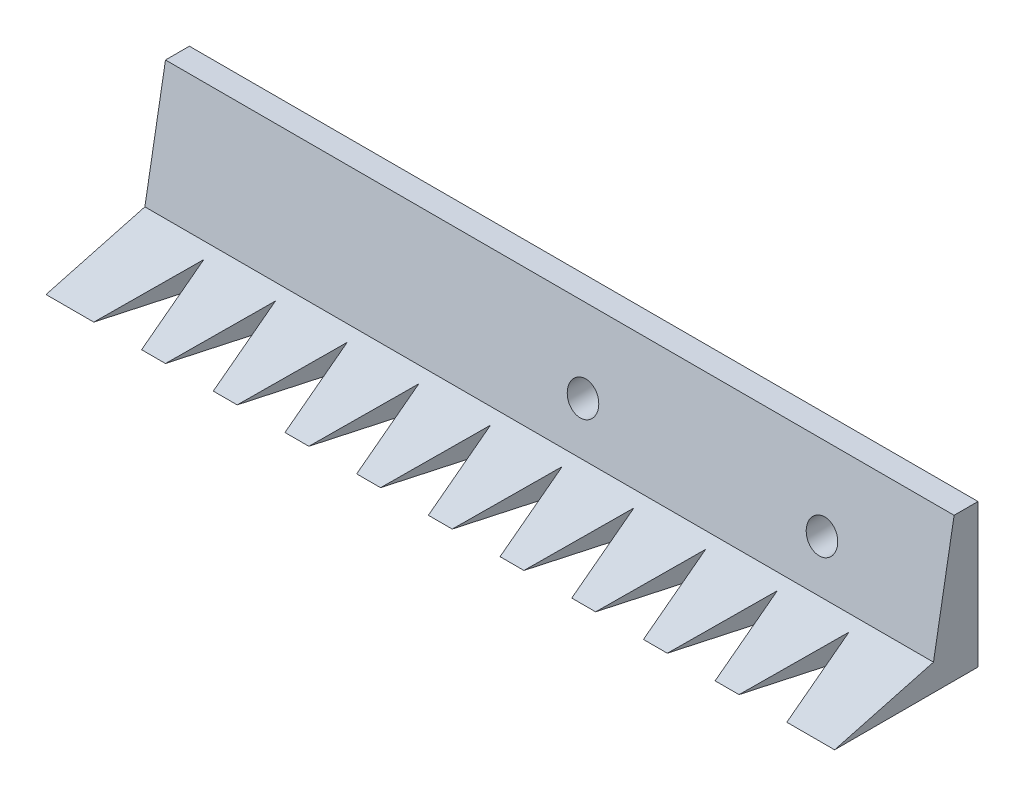
ISO-10303-21;
HEADER;
FILE_DESCRIPTION(('STEP AP214'),'2;1');
FILE_NAME('part.step','',(''),(''),'','','');
FILE_SCHEMA(('AUTOMOTIVE_DESIGN { 1 0 10303 214 1 1 1 1 }'));
ENDSEC;
DATA;
#1=APPLICATION_CONTEXT('core data for automotive mechanical design processes');
#2=APPLICATION_PROTOCOL_DEFINITION('international standard','automotive_design',2000,#1);
#3=PRODUCT_CONTEXT('',#1,'mechanical');
#4=PRODUCT('Part','Part','',(#3));
#5=PRODUCT_RELATED_PRODUCT_CATEGORY('part','',(#4));
#6=PRODUCT_DEFINITION_FORMATION('','',#4);
#7=PRODUCT_DEFINITION_CONTEXT('part definition',#1,'design');
#8=PRODUCT_DEFINITION('design','',#6,#7);
#9=PRODUCT_DEFINITION_SHAPE('','',#8);
#10=(LENGTH_UNIT() NAMED_UNIT(*) SI_UNIT(.MILLI.,.METRE.));
#11=(NAMED_UNIT(*) PLANE_ANGLE_UNIT() SI_UNIT($,.RADIAN.));
#12=(NAMED_UNIT(*) SI_UNIT($,.STERADIAN.) SOLID_ANGLE_UNIT());
#13=UNCERTAINTY_MEASURE_WITH_UNIT(LENGTH_MEASURE(1.E-05),#10,'distance_accuracy_value','');
#14=(GEOMETRIC_REPRESENTATION_CONTEXT(3) GLOBAL_UNCERTAINTY_ASSIGNED_CONTEXT((#13)) GLOBAL_UNIT_ASSIGNED_CONTEXT((#10,
#11,#12)) REPRESENTATION_CONTEXT('',''));
#15=CARTESIAN_POINT('',(0.,0.,0.));
#16=DIRECTION('',(0.,0.,1.));
#17=DIRECTION('',(1.,0.,0.));
#18=AXIS2_PLACEMENT_3D('',#15,#16,#17);
#19=CARTESIAN_POINT('',(100.,0.,30.));
#20=DIRECTION('',(0.,1.,0.));
#21=DIRECTION('',(0.,0.,1.));
#22=AXIS2_PLACEMENT_3D('',#19,#20,#21);
#23=PLANE('',#22);
#24=DIRECTION('',(0.267643863786095,0.,0.963517909629941));
#25=VECTOR('',#24,1.);
#26=CARTESIAN_POINT('',(-20.6876790830945,0.,63.5243553008596));
#27=LINE('',#26,#25);
#28=CARTESIAN_POINT('',(-35.,0.,12.));
#29=VERTEX_POINT('',#28);
#30=CARTESIAN_POINT('',(-30.,0.,30.));
#31=VERTEX_POINT('',#30);
#32=EDGE_CURVE('E267',#29,#31,#27,.T.);
#33=ORIENTED_EDGE('',*,*,#32,.F.);
#34=DIRECTION('',(0.267643863786095,0.,-0.963517909629941));
#35=VECTOR('',#34,1.);
#36=CARTESIAN_POINT('',(-29.9713467048711,0.,-6.10315186246417));
#37=LINE('',#36,#35);
#38=CARTESIAN_POINT('',(-40.,0.,30.));
#39=VERTEX_POINT('',#38);
#40=EDGE_CURVE('E265',#39,#29,#37,.T.);
#41=ORIENTED_EDGE('',*,*,#40,.F.);
#42=DIRECTION('',(-1.,0.,0.));
#43=VECTOR('',#42,1.);
#44=CARTESIAN_POINT('',(100.,0.,30.));
#45=LINE('',#44,#43);
#46=CARTESIAN_POINT('',(-45.,0.,30.));
#47=VERTEX_POINT('',#46);
#48=EDGE_CURVE('E321',#39,#47,#45,.T.);
#49=ORIENTED_EDGE('',*,*,#48,.T.);
#50=DIRECTION('',(0.267643863786095,0.,0.963517909629941));
#51=VECTOR('',#50,1.);
#52=CARTESIAN_POINT('',(-34.6131805157593,0.,67.3925501432665));
#53=LINE('',#52,#51);
#54=CARTESIAN_POINT('',(-50.,0.,12.));
#55=VERTEX_POINT('',#54);
#56=EDGE_CURVE('E274',#55,#47,#53,.T.);
#57=ORIENTED_EDGE('',*,*,#56,.F.);
#58=DIRECTION('',(0.267643863786095,0.,-0.963517909629941));
#59=VECTOR('',#58,1.);
#60=CARTESIAN_POINT('',(-43.8968481375358,0.,-9.97134670487103));
#61=LINE('',#60,#59);
#62=CARTESIAN_POINT('',(-55.,0.,30.));
#63=VERTEX_POINT('',#62);
#64=EDGE_CURVE('E272',#63,#55,#61,.T.);
#65=ORIENTED_EDGE('',*,*,#64,.F.);
#66=CARTESIAN_POINT('',(-65.,0.,30.));
#67=VERTEX_POINT('',#66);
#68=EDGE_CURVE('E317',#63,#67,#45,.T.);
#69=ORIENTED_EDGE('',*,*,#68,.T.);
#70=DIRECTION('',(0.,0.,1.));
#71=VECTOR('',#70,1.);
#72=CARTESIAN_POINT('',(-65.,0.,0.));
#73=LINE('',#72,#71);
#74=CARTESIAN_POINT('',(-65.,0.,0.));
#75=VERTEX_POINT('',#74);
#76=EDGE_CURVE('E280',#75,#67,#73,.T.);
#77=ORIENTED_EDGE('',*,*,#76,.F.);
#78=DIRECTION('',(-1.,0.,0.));
#79=VECTOR('',#78,1.);
#80=CARTESIAN_POINT('',(100.,0.,0.));
#81=LINE('',#80,#79);
#82=CARTESIAN_POINT('',(100.,0.,0.));
#83=VERTEX_POINT('',#82);
#84=EDGE_CURVE('E327',#83,#75,#81,.T.);
#85=ORIENTED_EDGE('',*,*,#84,.F.);
#86=DIRECTION('',(0.,0.,-1.));
#87=VECTOR('',#86,1.);
#88=CARTESIAN_POINT('',(100.,0.,30.));
#89=LINE('',#88,#87);
#90=CARTESIAN_POINT('',(100.,0.,30.));
#91=VERTEX_POINT('',#90);
#92=EDGE_CURVE('E306',#91,#83,#89,.T.);
#93=ORIENTED_EDGE('',*,*,#92,.F.);
#94=CARTESIAN_POINT('',(90.,0.,30.));
#95=VERTEX_POINT('',#94);
#96=EDGE_CURVE('E234',#91,#95,#45,.T.);
#97=ORIENTED_EDGE('',*,*,#96,.T.);
#98=DIRECTION('',(0.267643863786095,0.,0.963517909629941));
#99=VECTOR('',#98,1.);
#100=CARTESIAN_POINT('',(90.7163323782235,0.,32.5787965616046));
#101=LINE('',#100,#99);
#102=CARTESIAN_POINT('',(85.,0.,12.));
#103=VERTEX_POINT('',#102);
#104=EDGE_CURVE('E222',#103,#95,#101,.T.);
#105=ORIENTED_EDGE('',*,*,#104,.F.);
#106=DIRECTION('',(0.267643863786095,0.,-0.963517909629941));
#107=VECTOR('',#106,1.);
#108=CARTESIAN_POINT('',(81.432664756447,0.,24.8424068767908));
#109=LINE('',#108,#107);
#110=CARTESIAN_POINT('',(80.,0.,30.));
#111=VERTEX_POINT('',#110);
#112=EDGE_CURVE('E211',#111,#103,#109,.T.);
#113=ORIENTED_EDGE('',*,*,#112,.F.);
#114=CARTESIAN_POINT('',(75.,0.,30.));
#115=VERTEX_POINT('',#114);
#116=EDGE_CURVE('E320',#111,#115,#45,.T.);
#117=ORIENTED_EDGE('',*,*,#116,.T.);
#118=DIRECTION('',(0.267643863786095,0.,0.963517909629941));
#119=VECTOR('',#118,1.);
#120=CARTESIAN_POINT('',(76.7908309455588,0.,36.4469914040115));
#121=LINE('',#120,#119);
#122=CARTESIAN_POINT('',(70.,0.,12.));
#123=VERTEX_POINT('',#122);
#124=EDGE_CURVE('E237',#123,#115,#121,.T.);
#125=ORIENTED_EDGE('',*,*,#124,.F.);
#126=DIRECTION('',(0.267643863786095,0.,-0.963517909629941));
#127=VECTOR('',#126,1.);
#128=CARTESIAN_POINT('',(67.5071633237822,0.,20.974212034384));
#129=LINE('',#128,#127);
#130=CARTESIAN_POINT('',(65.,0.,30.));
#131=VERTEX_POINT('',#130);
#132=EDGE_CURVE('E235',#131,#123,#129,.T.);
#133=ORIENTED_EDGE('',*,*,#132,.F.);
#134=CARTESIAN_POINT('',(60.,0.,30.));
#135=VERTEX_POINT('',#134);
#136=EDGE_CURVE('E395',#131,#135,#45,.T.);
#137=ORIENTED_EDGE('',*,*,#136,.T.);
#138=DIRECTION('',(0.267643863786095,0.,0.963517909629941));
#139=VECTOR('',#138,1.);
#140=CARTESIAN_POINT('',(62.865329512894,0.,40.3151862464183));
#141=LINE('',#140,#139);
#142=CARTESIAN_POINT('',(55.,0.,12.));
#143=VERTEX_POINT('',#142);
#144=EDGE_CURVE('E243',#143,#135,#141,.T.);
#145=ORIENTED_EDGE('',*,*,#144,.F.);
#146=DIRECTION('',(0.267643863786095,0.,-0.963517909629941));
#147=VECTOR('',#146,1.);
#148=CARTESIAN_POINT('',(53.5816618911175,0.,17.1060171919771));
#149=LINE('',#148,#147);
#150=CARTESIAN_POINT('',(50.,0.,30.));
#151=VERTEX_POINT('',#150);
#152=EDGE_CURVE('E241',#151,#143,#149,.T.);
#153=ORIENTED_EDGE('',*,*,#152,.F.);
#154=CARTESIAN_POINT('',(45.,0.,30.));
#155=VERTEX_POINT('',#154);
#156=EDGE_CURVE('E398',#151,#155,#45,.T.);
#157=ORIENTED_EDGE('',*,*,#156,.T.);
#158=DIRECTION('',(0.267643863786095,0.,0.963517909629941));
#159=VECTOR('',#158,1.);
#160=CARTESIAN_POINT('',(48.9398280802292,0.,44.1833810888252));
#161=LINE('',#160,#159);
#162=CARTESIAN_POINT('',(40.,0.,12.));
#163=VERTEX_POINT('',#162);
#164=EDGE_CURVE('E247',#163,#155,#161,.T.);
#165=ORIENTED_EDGE('',*,*,#164,.F.);
#166=DIRECTION('',(0.267643863786094,0.,-0.963517909629941));
#167=VECTOR('',#166,1.);
#168=CARTESIAN_POINT('',(39.6561604584527,0.,13.2378223495702));
#169=LINE('',#168,#167);
#170=CARTESIAN_POINT('',(35.,0.,30.));
#171=VERTEX_POINT('',#170);
#172=EDGE_CURVE('E245',#171,#163,#169,.T.);
#173=ORIENTED_EDGE('',*,*,#172,.F.);
#174=CARTESIAN_POINT('',(30.,0.,30.));
#175=VERTEX_POINT('',#174);
#176=EDGE_CURVE('E403',#171,#175,#45,.T.);
#177=ORIENTED_EDGE('',*,*,#176,.T.);
#178=DIRECTION('',(0.267643863786095,0.,0.963517909629941));
#179=VECTOR('',#178,1.);
#180=CARTESIAN_POINT('',(35.0143266475645,0.,48.0515759312321));
#181=LINE('',#180,#179);
#182=CARTESIAN_POINT('',(25.,0.,12.));
#183=VERTEX_POINT('',#182);
#184=EDGE_CURVE('E251',#183,#175,#181,.T.);
#185=ORIENTED_EDGE('',*,*,#184,.F.);
#186=DIRECTION('',(0.267643863786094,0.,-0.963517909629941));
#187=VECTOR('',#186,1.);
#188=CARTESIAN_POINT('',(25.730659025788,0.,9.36962750716333));
#189=LINE('',#188,#187);
#190=CARTESIAN_POINT('',(20.,0.,30.));
#191=VERTEX_POINT('',#190);
#192=EDGE_CURVE('E249',#191,#183,#189,.T.);
#193=ORIENTED_EDGE('',*,*,#192,.F.);
#194=CARTESIAN_POINT('',(15.,0.,30.));
#195=VERTEX_POINT('',#194);
#196=EDGE_CURVE('E408',#191,#195,#45,.T.);
#197=ORIENTED_EDGE('',*,*,#196,.T.);
#198=DIRECTION('',(0.267643863786095,0.,0.963517909629941));
#199=VECTOR('',#198,1.);
#200=CARTESIAN_POINT('',(21.0888252148997,0.,51.919770773639));
#201=LINE('',#200,#199);
#202=CARTESIAN_POINT('',(9.99999999999999,0.,12.));
#203=VERTEX_POINT('',#202);
#204=EDGE_CURVE('E255',#203,#195,#201,.T.);
#205=ORIENTED_EDGE('',*,*,#204,.F.);
#206=DIRECTION('',(0.267643863786094,0.,-0.963517909629941));
#207=VECTOR('',#206,1.);
#208=CARTESIAN_POINT('',(11.8051575931232,0.,5.50143266475646));
#209=LINE('',#208,#207);
#210=CARTESIAN_POINT('',(5.,0.,30.));
#211=VERTEX_POINT('',#210);
#212=EDGE_CURVE('E253',#211,#203,#209,.T.);
#213=ORIENTED_EDGE('',*,*,#212,.F.);
#214=CARTESIAN_POINT('',(0.,0.,30.));
#215=VERTEX_POINT('',#214);
#216=EDGE_CURVE('E413',#211,#215,#45,.T.);
#217=ORIENTED_EDGE('',*,*,#216,.T.);
#218=DIRECTION('',(0.267643863786095,0.,0.963517909629941));
#219=VECTOR('',#218,1.);
#220=CARTESIAN_POINT('',(7.16332378223497,0.,55.7879656160459));
#221=LINE('',#220,#219);
#222=CARTESIAN_POINT('',(-5.,0.,12.));
#223=VERTEX_POINT('',#222);
#224=EDGE_CURVE('E259',#223,#215,#221,.T.);
#225=ORIENTED_EDGE('',*,*,#224,.F.);
#226=DIRECTION('',(0.267643863786094,0.,-0.963517909629941));
#227=VECTOR('',#226,1.);
#228=CARTESIAN_POINT('',(-2.12034383954156,0.,1.63323782234958));
#229=LINE('',#228,#227);
#230=CARTESIAN_POINT('',(-10.,0.,30.));
#231=VERTEX_POINT('',#230);
#232=EDGE_CURVE('E257',#231,#223,#229,.T.);
#233=ORIENTED_EDGE('',*,*,#232,.F.);
#234=CARTESIAN_POINT('',(-15.,0.,30.));
#235=VERTEX_POINT('',#234);
#236=EDGE_CURVE('E391',#231,#235,#45,.T.);
#237=ORIENTED_EDGE('',*,*,#236,.T.);
#238=DIRECTION('',(0.267643863786095,0.,0.963517909629941));
#239=VECTOR('',#238,1.);
#240=CARTESIAN_POINT('',(-6.76217765042979,0.,59.6561604584527));
#241=LINE('',#240,#239);
#242=CARTESIAN_POINT('',(-20.,0.,12.));
#243=VERTEX_POINT('',#242);
#244=EDGE_CURVE('E263',#243,#235,#241,.T.);
#245=ORIENTED_EDGE('',*,*,#244,.F.);
#246=DIRECTION('',(0.267643863786095,0.,-0.963517909629941));
#247=VECTOR('',#246,1.);
#248=CARTESIAN_POINT('',(-16.0458452722063,0.,-2.23495702005729));
#249=LINE('',#248,#247);
#250=CARTESIAN_POINT('',(-25.,0.,30.));
#251=VERTEX_POINT('',#250);
#252=EDGE_CURVE('E261',#251,#243,#249,.T.);
#253=ORIENTED_EDGE('',*,*,#252,.F.);
#254=EDGE_CURVE('E390',#251,#31,#45,.T.);
#255=ORIENTED_EDGE('',*,*,#254,.T.);
#256=EDGE_LOOP('',(#33,#41,#49,#57,#65,#69,#77,#85,#93,#97,#105,#113,#117,#125,#133,#137,#145,
#153,#157,#165,#173,#177,#185,#193,#197,#205,#213,#217,#225,#233,#237,#245,#253,#255));
#257=FACE_BOUND('',#256,.T.);
#258=ADVANCED_FACE('F47',(#257),#23,.F.);
#259=CARTESIAN_POINT('',(100.,0.,30.));
#260=DIRECTION('',(0.,-0.965925826289068,-0.258819045102522));
#261=DIRECTION('',(0.,0.258819045102522,-0.965925826289068));
#262=AXIS2_PLACEMENT_3D('',#259,#260,#261);
#263=PLANE('',#262);
#264=DIRECTION('',(-0.259146627711524,0.249977266619586,-0.932927859761485));
#265=VECTOR('',#264,1.);
#266=CARTESIAN_POINT('',(-21.2695932949468,-8.42149953437134,61.4294641381914));
#267=LINE('',#266,#265);
#268=CARTESIAN_POINT('',(-35.,4.82308546376022,12.));
#269=VERTEX_POINT('',#268);
#270=EDGE_CURVE('E11',#31,#269,#267,.T.);
#271=ORIENTED_EDGE('',*,*,#270,.F.);
#272=ORIENTED_EDGE('',*,*,#254,.F.);
#273=DIRECTION('',(-0.259146627711523,-0.249977266619586,0.932927859761485));
#274=VECTOR('',#273,1.);
#275=CARTESIAN_POINT('',(-16.6053781682181,8.09759570612628,-0.220638594414749));
#276=LINE('',#275,#274);
#277=CARTESIAN_POINT('',(-20.,4.82308546376022,12.));
#278=VERTEX_POINT('',#277);
#279=EDGE_CURVE('E376',#278,#251,#276,.T.);
#280=ORIENTED_EDGE('',*,*,#279,.F.);
#281=DIRECTION('',(-0.259146627711524,0.249977266619586,-0.932927859761485));
#282=VECTOR('',#281,1.);
#283=CARTESIAN_POINT('',(-7.27694791476068,-7.44978804963619,57.8029875068616));
#284=LINE('',#283,#282);
#285=EDGE_CURVE('E378',#235,#278,#284,.T.);
#286=ORIENTED_EDGE('',*,*,#285,.F.);
#287=ORIENTED_EDGE('',*,*,#236,.F.);
#288=DIRECTION('',(-0.259146627711523,-0.249977266619586,0.932927859761485));
#289=VECTOR('',#288,1.);
#290=CARTESIAN_POINT('',(-2.61273278803197,7.12588422139113,3.40583803691502));
#291=LINE('',#290,#289);
#292=CARTESIAN_POINT('',(-5.00000000000001,4.82308546376022,12.));
#293=VERTEX_POINT('',#292);
#294=EDGE_CURVE('E371',#293,#231,#291,.T.);
#295=ORIENTED_EDGE('',*,*,#294,.F.);
#296=DIRECTION('',(-0.259146627711524,0.249977266619586,-0.932927859761485));
#297=VECTOR('',#296,1.);
#298=CARTESIAN_POINT('',(6.71569746542551,-6.47807656490103,54.1765108755318));
#299=LINE('',#298,#297);
#300=EDGE_CURVE('E373',#215,#293,#299,.T.);
#301=ORIENTED_EDGE('',*,*,#300,.F.);
#302=ORIENTED_EDGE('',*,*,#216,.F.);
#303=DIRECTION('',(-0.259146627711523,-0.249977266619586,0.932927859761485));
#304=VECTOR('',#303,1.);
#305=CARTESIAN_POINT('',(11.3799125921542,6.15417273665597,7.03231466824479));
#306=LINE('',#305,#304);
#307=CARTESIAN_POINT('',(10.,4.82308546376023,12.));
#308=VERTEX_POINT('',#307);
#309=EDGE_CURVE('E366',#308,#211,#306,.T.);
#310=ORIENTED_EDGE('',*,*,#309,.F.);
#311=DIRECTION('',(-0.259146627711524,0.249977266619586,-0.932927859761485));
#312=VECTOR('',#311,1.);
#313=CARTESIAN_POINT('',(20.7083428456117,-5.50636508016587,50.550034244202));
#314=LINE('',#313,#312);
#315=EDGE_CURVE('E368',#195,#308,#314,.T.);
#316=ORIENTED_EDGE('',*,*,#315,.F.);
#317=ORIENTED_EDGE('',*,*,#196,.F.);
#318=DIRECTION('',(-0.259146627711523,-0.249977266619586,0.932927859761485));
#319=VECTOR('',#318,1.);
#320=CARTESIAN_POINT('',(25.3725579723404,5.18246125192082,10.6587912995746));
#321=LINE('',#320,#319);
#322=CARTESIAN_POINT('',(25.,4.82308546376022,12.));
#323=VERTEX_POINT('',#322);
#324=EDGE_CURVE('E361',#323,#191,#321,.T.);
#325=ORIENTED_EDGE('',*,*,#324,.F.);
#326=DIRECTION('',(-0.259146627711524,0.249977266619586,-0.932927859761485));
#327=VECTOR('',#326,1.);
#328=CARTESIAN_POINT('',(34.7009882257979,-4.53465359543072,46.9235576128723));
#329=LINE('',#328,#327);
#330=EDGE_CURVE('E363',#175,#323,#329,.T.);
#331=ORIENTED_EDGE('',*,*,#330,.F.);
#332=ORIENTED_EDGE('',*,*,#176,.F.);
#333=DIRECTION('',(-0.259146627711523,-0.249977266619586,0.932927859761485));
#334=VECTOR('',#333,1.);
#335=CARTESIAN_POINT('',(39.3652033525266,4.21074976718566,14.2852679309043));
#336=LINE('',#335,#334);
#337=CARTESIAN_POINT('',(40.,4.82308546376022,12.));
#338=VERTEX_POINT('',#337);
#339=EDGE_CURVE('E356',#338,#171,#336,.T.);
#340=ORIENTED_EDGE('',*,*,#339,.F.);
#341=DIRECTION('',(-0.259146627711524,0.249977266619586,-0.932927859761485));
#342=VECTOR('',#341,1.);
#343=CARTESIAN_POINT('',(48.693633605984,-3.56294211069557,43.2970809815425));
#344=LINE('',#343,#342);
#345=EDGE_CURVE('E358',#155,#338,#344,.T.);
#346=ORIENTED_EDGE('',*,*,#345,.F.);
#347=ORIENTED_EDGE('',*,*,#156,.F.);
#348=DIRECTION('',(-0.259146627711524,-0.249977266619586,0.932927859761485));
#349=VECTOR('',#348,1.);
#350=CARTESIAN_POINT('',(53.3578487327127,3.23903828245051,17.9117445622341));
#351=LINE('',#350,#349);
#352=CARTESIAN_POINT('',(55.,4.82308546376023,12.));
#353=VERTEX_POINT('',#352);
#354=EDGE_CURVE('E351',#353,#151,#351,.T.);
#355=ORIENTED_EDGE('',*,*,#354,.F.);
#356=DIRECTION('',(-0.259146627711524,0.249977266619586,-0.932927859761485));
#357=VECTOR('',#356,1.);
#358=CARTESIAN_POINT('',(62.6862789861702,-2.59123062596041,39.6706043502127));
#359=LINE('',#358,#357);
#360=EDGE_CURVE('E353',#135,#353,#359,.T.);
#361=ORIENTED_EDGE('',*,*,#360,.F.);
#362=ORIENTED_EDGE('',*,*,#136,.F.);
#363=DIRECTION('',(-0.259146627711524,-0.249977266619586,0.932927859761485));
#364=VECTOR('',#363,1.);
#365=CARTESIAN_POINT('',(67.3504941128989,2.26732679771536,21.5382211935639));
#366=LINE('',#365,#364);
#367=CARTESIAN_POINT('',(70.,4.82308546376023,12.));
#368=VERTEX_POINT('',#367);
#369=EDGE_CURVE('E346',#368,#131,#366,.T.);
#370=ORIENTED_EDGE('',*,*,#369,.F.);
#371=DIRECTION('',(-0.259146627711524,0.249977266619586,-0.932927859761485));
#372=VECTOR('',#371,1.);
#373=CARTESIAN_POINT('',(76.6789243663564,-1.61951914122526,36.044127718883));
#374=LINE('',#373,#372);
#375=EDGE_CURVE('E348',#115,#368,#374,.T.);
#376=ORIENTED_EDGE('',*,*,#375,.F.);
#377=ORIENTED_EDGE('',*,*,#116,.F.);
#378=DIRECTION('',(-0.259146627711524,-0.249977266619586,0.932927859761485));
#379=VECTOR('',#378,1.);
#380=CARTESIAN_POINT('',(81.3431394930851,1.2956153129802,25.1646978248936));
#381=LINE('',#380,#379);
#382=CARTESIAN_POINT('',(85.,4.82308546376023,12.));
#383=VERTEX_POINT('',#382);
#384=EDGE_CURVE('E217',#383,#111,#381,.T.);
#385=ORIENTED_EDGE('',*,*,#384,.F.);
#386=DIRECTION('',(-0.259146627711524,0.249977266619586,-0.932927859761485));
#387=VECTOR('',#386,1.);
#388=CARTESIAN_POINT('',(90.6715697465426,-0.647807656490103,32.4176510875532));
#389=LINE('',#388,#387);
#390=EDGE_CURVE('E227',#95,#383,#389,.T.);
#391=ORIENTED_EDGE('',*,*,#390,.F.);
#392=ORIENTED_EDGE('',*,*,#96,.F.);
#393=DIRECTION('',(0.,-0.258819045102522,0.965925826289068));
#394=VECTOR('',#393,1.);
#395=CARTESIAN_POINT('',(100.,0.,30.));
#396=LINE('',#395,#394);
#397=CARTESIAN_POINT('',(100.,5.5432287597402,9.31238863067264));
#398=VERTEX_POINT('',#397);
#399=EDGE_CURVE('E315',#398,#91,#396,.T.);
#400=ORIENTED_EDGE('',*,*,#399,.F.);
#401=DIRECTION('',(-1.,0.,0.));
#402=VECTOR('',#401,1.);
#403=CARTESIAN_POINT('',(100.,5.5432287597402,9.31238863067264));
#404=LINE('',#403,#402);
#405=CARTESIAN_POINT('',(-65.,5.5432287597402,9.31238863067264));
#406=VERTEX_POINT('',#405);
#407=EDGE_CURVE('E319',#398,#406,#404,.T.);
#408=ORIENTED_EDGE('',*,*,#407,.T.);
#409=DIRECTION('',(0.,0.258819045102522,-0.965925826289068));
#410=VECTOR('',#409,1.);
#411=CARTESIAN_POINT('',(-65.,0.,30.));
#412=LINE('',#411,#410);
#413=EDGE_CURVE('E283',#67,#406,#412,.T.);
#414=ORIENTED_EDGE('',*,*,#413,.F.);
#415=ORIENTED_EDGE('',*,*,#68,.F.);
#416=DIRECTION('',(-0.259146627711523,-0.249977266619586,0.932927859761485));
#417=VECTOR('',#416,1.);
#418=CARTESIAN_POINT('',(-44.5906689285905,10.0410186755966,-7.47359185707428));
#419=LINE('',#418,#417);
#420=CARTESIAN_POINT('',(-50.,4.82308546376022,12.));
#421=VERTEX_POINT('',#420);
#422=EDGE_CURVE('E329',#421,#63,#419,.T.);
#423=ORIENTED_EDGE('',*,*,#422,.F.);
#424=DIRECTION('',(-0.259146627711524,0.249977266619586,-0.932927859761485));
#425=VECTOR('',#424,1.);
#426=CARTESIAN_POINT('',(-35.262238675133,-9.3932110191065,65.0559407695211));
#427=LINE('',#426,#425);
#428=EDGE_CURVE('E341',#47,#421,#427,.T.);
#429=ORIENTED_EDGE('',*,*,#428,.F.);
#430=ORIENTED_EDGE('',*,*,#48,.F.);
#431=DIRECTION('',(-0.259146627711523,-0.249977266619586,0.932927859761485));
#432=VECTOR('',#431,1.);
#433=CARTESIAN_POINT('',(-30.5980235484043,9.06930719086143,-3.84711522574452));
#434=LINE('',#433,#432);
#435=EDGE_CURVE('E54',#269,#39,#434,.T.);
#436=ORIENTED_EDGE('',*,*,#435,.F.);
#437=EDGE_LOOP('',(#271,#272,#280,#286,#287,#295,#301,#302,#310,#316,#317,#325,#331,#332,#340,
#346,#347,#355,#361,#362,#370,#376,#377,#385,#391,#392,#400,#408,#414,#415,#423,#429,#430,#436));
#438=FACE_BOUND('',#437,.T.);
#439=ADVANCED_FACE('F388',(#438),#263,.F.);
#440=CARTESIAN_POINT('',(100.,0.,0.));
#441=DIRECTION('',(0.,0.,1.));
#442=DIRECTION('',(1.,0.,0.));
#443=AXIS2_PLACEMENT_3D('',#440,#441,#442);
#444=PLANE('',#443);
#445=CARTESIAN_POINT('',(75.,15.,0.));
#446=DIRECTION('',(0.,0.,-1.));
#447=DIRECTION('',(-1.,0.,0.));
#448=AXIS2_PLACEMENT_3D('',#445,#446,#447);
#449=CIRCLE('',#448,1.69999999999999);
#450=CARTESIAN_POINT('',(73.3,15.,0.));
#451=VERTEX_POINT('',#450);
#452=EDGE_CURVE('E299',#451,#451,#449,.T.);
#453=ORIENTED_EDGE('',*,*,#452,.F.);
#454=EDGE_LOOP('',(#453));
#455=FACE_BOUND('',#454,.T.);
#456=CARTESIAN_POINT('',(25.,15.,0.));
#457=DIRECTION('',(0.,0.,-1.));
#458=DIRECTION('',(-1.,0.,0.));
#459=AXIS2_PLACEMENT_3D('',#456,#457,#458);
#460=CIRCLE('',#459,1.7);
#461=CARTESIAN_POINT('',(23.3,15.,0.));
#462=VERTEX_POINT('',#461);
#463=EDGE_CURVE('E302',#462,#462,#460,.T.);
#464=ORIENTED_EDGE('',*,*,#463,.F.);
#465=EDGE_LOOP('',(#464));
#466=FACE_BOUND('',#465,.T.);
#467=ORIENTED_EDGE('',*,*,#84,.T.);
#468=DIRECTION('',(0.,-1.,0.));
#469=VECTOR('',#468,1.);
#470=CARTESIAN_POINT('',(-65.,30.,0.));
#471=LINE('',#470,#469);
#472=CARTESIAN_POINT('',(-65.,30.,0.));
#473=VERTEX_POINT('',#472);
#474=EDGE_CURVE('E277',#473,#75,#471,.T.);
#475=ORIENTED_EDGE('',*,*,#474,.F.);
#476=DIRECTION('',(-1.,0.,0.));
#477=VECTOR('',#476,1.);
#478=CARTESIAN_POINT('',(100.,30.,0.));
#479=LINE('',#478,#477);
#480=CARTESIAN_POINT('',(100.,30.,0.));
#481=VERTEX_POINT('',#480);
#482=EDGE_CURVE('E325',#481,#473,#479,.T.);
#483=ORIENTED_EDGE('',*,*,#482,.F.);
#484=DIRECTION('',(0.,1.,0.));
#485=VECTOR('',#484,1.);
#486=CARTESIAN_POINT('',(100.,0.,0.));
#487=LINE('',#486,#485);
#488=EDGE_CURVE('E309',#83,#481,#487,.T.);
#489=ORIENTED_EDGE('',*,*,#488,.F.);
#490=EDGE_LOOP('',(#467,#475,#483,#489));
#491=FACE_BOUND('',#490,.T.);
#492=ADVANCED_FACE('F496',(#455,#466,#491),#444,.F.);
#493=CARTESIAN_POINT('',(100.,30.,5.));
#494=DIRECTION('',(0.,-1.,0.));
#495=DIRECTION('',(0.,0.,-1.));
#496=AXIS2_PLACEMENT_3D('',#493,#494,#495);
#497=PLANE('',#496);
#498=ORIENTED_EDGE('',*,*,#482,.T.);
#499=DIRECTION('',(0.,0.,-1.));
#500=VECTOR('',#499,1.);
#501=CARTESIAN_POINT('',(-65.,30.,5.));
#502=LINE('',#501,#500);
#503=CARTESIAN_POINT('',(-65.,30.,5.));
#504=VERTEX_POINT('',#503);
#505=EDGE_CURVE('E289',#504,#473,#502,.T.);
#506=ORIENTED_EDGE('',*,*,#505,.F.);
#507=DIRECTION('',(-1.,0.,0.));
#508=VECTOR('',#507,1.);
#509=CARTESIAN_POINT('',(100.,30.,5.));
#510=LINE('',#509,#508);
#511=CARTESIAN_POINT('',(100.,30.,5.));
#512=VERTEX_POINT('',#511);
#513=EDGE_CURVE('E323',#512,#504,#510,.T.);
#514=ORIENTED_EDGE('',*,*,#513,.F.);
#515=DIRECTION('',(0.,0.,1.));
#516=VECTOR('',#515,1.);
#517=CARTESIAN_POINT('',(100.,30.,5.));
#518=LINE('',#517,#516);
#519=EDGE_CURVE('E311',#481,#512,#518,.T.);
#520=ORIENTED_EDGE('',*,*,#519,.F.);
#521=EDGE_LOOP('',(#498,#506,#514,#520));
#522=FACE_BOUND('',#521,.T.);
#523=ADVANCED_FACE('F502',(#522),#497,.F.);
#524=CARTESIAN_POINT('',(100.,5.5432287597402,9.31238863067264));
#525=DIRECTION('',(0.,-0.173648177666931,-0.984807753012208));
#526=DIRECTION('',(0.,0.984807753012208,-0.173648177666931));
#527=AXIS2_PLACEMENT_3D('',#524,#525,#526);
#528=PLANE('',#527);
#529=CARTESIAN_POINT('',(75.,15.,7.64490471062698));
#530=DIRECTION('',(0.,-0.173648177666931,-0.984807753012208));
#531=DIRECTION('',(0.,0.984807753012208,-0.173648177666931));
#532=AXIS2_PLACEMENT_3D('',#529,#530,#531);
#533=ELLIPSE('',#532,3.30013648862868,3.25000000000001);
#534=CARTESIAN_POINT('',(75.,18.25,7.07184202332447));
#535=VERTEX_POINT('',#534);
#536=EDGE_CURVE('E303',#535,#535,#533,.T.);
#537=ORIENTED_EDGE('',*,*,#536,.T.);
#538=EDGE_LOOP('',(#537));
#539=FACE_BOUND('',#538,.T.);
#540=CARTESIAN_POINT('',(25.,15.,7.64490471062698));
#541=DIRECTION('',(0.,-0.173648177666931,-0.984807753012208));
#542=DIRECTION('',(0.,0.984807753012208,-0.173648177666931));
#543=AXIS2_PLACEMENT_3D('',#540,#541,#542);
#544=ELLIPSE('',#543,3.30013648862867,3.25);
#545=CARTESIAN_POINT('',(25.,18.25,7.07184202332447));
#546=VERTEX_POINT('',#545);
#547=EDGE_CURVE('E335',#546,#546,#544,.T.);
#548=ORIENTED_EDGE('',*,*,#547,.T.);
#549=EDGE_LOOP('',(#548));
#550=FACE_BOUND('',#549,.T.);
#551=ORIENTED_EDGE('',*,*,#513,.T.);
#552=DIRECTION('',(0.,0.984807753012208,-0.173648177666931));
#553=VECTOR('',#552,1.);
#554=CARTESIAN_POINT('',(-65.,5.5432287597402,9.31238863067264));
#555=LINE('',#554,#553);
#556=EDGE_CURVE('E286',#406,#504,#555,.T.);
#557=ORIENTED_EDGE('',*,*,#556,.F.);
#558=ORIENTED_EDGE('',*,*,#407,.F.);
#559=DIRECTION('',(0.,-0.984807753012208,0.173648177666931));
#560=VECTOR('',#559,1.);
#561=CARTESIAN_POINT('',(100.,5.5432287597402,9.31238863067264));
#562=LINE('',#561,#560);
#563=EDGE_CURVE('E313',#512,#398,#562,.T.);
#564=ORIENTED_EDGE('',*,*,#563,.F.);
#565=EDGE_LOOP('',(#551,#557,#558,#564));
#566=FACE_BOUND('',#565,.T.);
#567=ADVANCED_FACE('F508',(#539,#550,#566),#528,.F.);
#568=CARTESIAN_POINT('',(100.,0.,0.));
#569=DIRECTION('',(1.,0.,0.));
#570=DIRECTION('',(0.,0.,-1.));
#571=AXIS2_PLACEMENT_3D('',#568,#569,#570);
#572=PLANE('',#571);
#573=ORIENTED_EDGE('',*,*,#92,.T.);
#574=ORIENTED_EDGE('',*,*,#488,.T.);
#575=ORIENTED_EDGE('',*,*,#519,.T.);
#576=ORIENTED_EDGE('',*,*,#563,.T.);
#577=ORIENTED_EDGE('',*,*,#399,.T.);
#578=EDGE_LOOP('',(#573,#574,#575,#576,#577));
#579=FACE_BOUND('',#578,.T.);
#580=ADVANCED_FACE('F506',(#579),#572,.T.);
#581=CARTESIAN_POINT('',(25.,15.,0.));
#582=DIRECTION('',(0.,0.,-1.));
#583=DIRECTION('',(-1.,0.,0.));
#584=AXIS2_PLACEMENT_3D('',#581,#582,#583);
#585=CYLINDRICAL_SURFACE('',#584,1.69999999999999);
#586=CARTESIAN_POINT('',(25.,15.,2.5));
#587=DIRECTION('',(0.,0.,-1.));
#588=DIRECTION('',(-1.,0.,0.));
#589=AXIS2_PLACEMENT_3D('',#586,#587,#588);
#590=CIRCLE('',#589,1.69999999999999);
#591=CARTESIAN_POINT('',(23.3,15.,2.5));
#592=VERTEX_POINT('',#591);
#593=EDGE_CURVE('E332',#592,#592,#590,.F.);
#594=ORIENTED_EDGE('',*,*,#593,.T.);
#595=EDGE_LOOP('',(#594));
#596=FACE_BOUND('',#595,.T.);
#597=ORIENTED_EDGE('',*,*,#463,.T.);
#598=EDGE_LOOP('',(#597));
#599=FACE_BOUND('',#598,.T.);
#600=ADVANCED_FACE('F533',(#596,#599),#585,.F.);
#601=CARTESIAN_POINT('',(75.,15.,0.));
#602=DIRECTION('',(0.,0.,-1.));
#603=DIRECTION('',(-1.,0.,0.));
#604=AXIS2_PLACEMENT_3D('',#601,#602,#603);
#605=CYLINDRICAL_SURFACE('',#604,1.69999999999999);
#606=CARTESIAN_POINT('',(75.,15.,2.5));
#607=DIRECTION('',(0.,0.,-1.));
#608=DIRECTION('',(-1.,0.,0.));
#609=AXIS2_PLACEMENT_3D('',#606,#607,#608);
#610=CIRCLE('',#609,1.69999999999999);
#611=CARTESIAN_POINT('',(73.3,15.,2.5));
#612=VERTEX_POINT('',#611);
#613=EDGE_CURVE('E296',#612,#612,#610,.F.);
#614=ORIENTED_EDGE('',*,*,#613,.T.);
#615=EDGE_LOOP('',(#614));
#616=FACE_BOUND('',#615,.T.);
#617=ORIENTED_EDGE('',*,*,#452,.T.);
#618=EDGE_LOOP('',(#617));
#619=FACE_BOUND('',#618,.T.);
#620=ADVANCED_FACE('F537',(#616,#619),#605,.F.);
#621=CARTESIAN_POINT('',(75.,15.,30.));
#622=DIRECTION('',(0.,0.,-1.));
#623=DIRECTION('',(-1.,0.,0.));
#624=AXIS2_PLACEMENT_3D('',#621,#622,#623);
#625=CYLINDRICAL_SURFACE('',#624,3.25000000000001);
#626=CARTESIAN_POINT('',(75.,15.,2.5));
#627=DIRECTION('',(0.,0.,-1.));
#628=DIRECTION('',(-1.,0.,0.));
#629=AXIS2_PLACEMENT_3D('',#626,#627,#628);
#630=CIRCLE('',#629,3.25000000000001);
#631=CARTESIAN_POINT('',(71.75,15.,2.5));
#632=VERTEX_POINT('',#631);
#633=EDGE_CURVE('E293',#632,#632,#630,.T.);
#634=ORIENTED_EDGE('',*,*,#633,.T.);
#635=EDGE_LOOP('',(#634));
#636=FACE_BOUND('',#635,.T.);
#637=ORIENTED_EDGE('',*,*,#536,.F.);
#638=EDGE_LOOP('',(#637));
#639=FACE_BOUND('',#638,.T.);
#640=ADVANCED_FACE('F542',(#636,#639),#625,.F.);
#641=CARTESIAN_POINT('',(75.,15.,2.5));
#642=DIRECTION('',(0.,0.,-1.));
#643=DIRECTION('',(-1.,0.,0.));
#644=AXIS2_PLACEMENT_3D('',#641,#642,#643);
#645=PLANE('',#644);
#646=ORIENTED_EDGE('',*,*,#633,.F.);
#647=EDGE_LOOP('',(#646));
#648=FACE_BOUND('',#647,.T.);
#649=ORIENTED_EDGE('',*,*,#613,.F.);
#650=EDGE_LOOP('',(#649));
#651=FACE_BOUND('',#650,.T.);
#652=ADVANCED_FACE('F554',(#648,#651),#645,.F.);
#653=CARTESIAN_POINT('',(25.,15.,30.));
#654=DIRECTION('',(0.,0.,-1.));
#655=DIRECTION('',(-1.,0.,0.));
#656=AXIS2_PLACEMENT_3D('',#653,#654,#655);
#657=CYLINDRICAL_SURFACE('',#656,3.25);
#658=CARTESIAN_POINT('',(25.,15.,2.5));
#659=DIRECTION('',(0.,0.,-1.));
#660=DIRECTION('',(-1.,0.,0.));
#661=AXIS2_PLACEMENT_3D('',#658,#659,#660);
#662=CIRCLE('',#661,3.25);
#663=CARTESIAN_POINT('',(21.75,15.,2.5));
#664=VERTEX_POINT('',#663);
#665=EDGE_CURVE('E292',#664,#664,#662,.T.);
#666=ORIENTED_EDGE('',*,*,#665,.T.);
#667=EDGE_LOOP('',(#666));
#668=FACE_BOUND('',#667,.T.);
#669=ORIENTED_EDGE('',*,*,#547,.F.);
#670=EDGE_LOOP('',(#669));
#671=FACE_BOUND('',#670,.T.);
#672=ADVANCED_FACE('F550',(#668,#671),#657,.F.);
#673=CARTESIAN_POINT('',(25.,15.,2.5));
#674=DIRECTION('',(0.,0.,-1.));
#675=DIRECTION('',(-1.,0.,0.));
#676=AXIS2_PLACEMENT_3D('',#673,#674,#675);
#677=PLANE('',#676);
#678=ORIENTED_EDGE('',*,*,#665,.F.);
#679=EDGE_LOOP('',(#678));
#680=FACE_BOUND('',#679,.T.);
#681=ORIENTED_EDGE('',*,*,#593,.F.);
#682=EDGE_LOOP('',(#681));
#683=FACE_BOUND('',#682,.T.);
#684=ADVANCED_FACE('F547',(#680,#683),#677,.F.);
#685=CARTESIAN_POINT('',(-65.,0.,0.));
#686=DIRECTION('',(-1.,0.,0.));
#687=DIRECTION('',(0.,0.,1.));
#688=AXIS2_PLACEMENT_3D('',#685,#686,#687);
#689=PLANE('',#688);
#690=ORIENTED_EDGE('',*,*,#474,.T.);
#691=ORIENTED_EDGE('',*,*,#76,.T.);
#692=ORIENTED_EDGE('',*,*,#413,.T.);
#693=ORIENTED_EDGE('',*,*,#556,.T.);
#694=ORIENTED_EDGE('',*,*,#505,.T.);
#695=EDGE_LOOP('',(#690,#691,#692,#693,#694));
#696=FACE_BOUND('',#695,.T.);
#697=ADVANCED_FACE('F523',(#696),#689,.T.);
#698=CARTESIAN_POINT('',(-50.,30.,12.));
#699=DIRECTION('',(-0.963517909629941,0.,0.267643863786095));
#700=DIRECTION('',(0.267643863786095,0.,0.963517909629941));
#701=AXIS2_PLACEMENT_3D('',#698,#699,#700);
#702=PLANE('',#701);
#703=ORIENTED_EDGE('',*,*,#56,.T.);
#704=ORIENTED_EDGE('',*,*,#428,.T.);
#705=DIRECTION('',(0.,-1.,0.));
#706=VECTOR('',#705,1.);
#707=CARTESIAN_POINT('',(-50.,30.,12.));
#708=LINE('',#707,#706);
#709=EDGE_CURVE('E269',#421,#55,#708,.T.);
#710=ORIENTED_EDGE('',*,*,#709,.T.);
#711=EDGE_LOOP('',(#703,#704,#710));
#712=FACE_BOUND('',#711,.T.);
#713=ADVANCED_FACE('F564',(#712),#702,.T.);
#714=CARTESIAN_POINT('',(-55.,30.,30.));
#715=DIRECTION('',(0.963517909629941,0.,0.267643863786094));
#716=DIRECTION('',(0.267643863786095,0.,-0.963517909629941));
#717=AXIS2_PLACEMENT_3D('',#714,#715,#716);
#718=PLANE('',#717);
#719=ORIENTED_EDGE('',*,*,#64,.T.);
#720=ORIENTED_EDGE('',*,*,#709,.F.);
#721=ORIENTED_EDGE('',*,*,#422,.T.);
#722=EDGE_LOOP('',(#719,#720,#721));
#723=FACE_BOUND('',#722,.T.);
#724=ADVANCED_FACE('F567',(#723),#718,.T.);
#725=CARTESIAN_POINT('',(85.,30.,12.));
#726=DIRECTION('',(-0.963517909629941,0.,0.267643863786095));
#727=DIRECTION('',(0.267643863786095,0.,0.963517909629941));
#728=AXIS2_PLACEMENT_3D('',#725,#726,#727);
#729=PLANE('',#728);
#730=ORIENTED_EDGE('',*,*,#104,.T.);
#731=ORIENTED_EDGE('',*,*,#390,.T.);
#732=DIRECTION('',(0.,-1.,0.));
#733=VECTOR('',#732,1.);
#734=CARTESIAN_POINT('',(85.,30.,12.));
#735=LINE('',#734,#733);
#736=EDGE_CURVE('E214',#383,#103,#735,.T.);
#737=ORIENTED_EDGE('',*,*,#736,.T.);
#738=EDGE_LOOP('',(#730,#731,#737));
#739=FACE_BOUND('',#738,.T.);
#740=ADVANCED_FACE('F225',(#739),#729,.T.);
#741=CARTESIAN_POINT('',(80.,30.,30.));
#742=DIRECTION('',(0.963517909629941,0.,0.267643863786095));
#743=DIRECTION('',(0.267643863786095,0.,-0.963517909629941));
#744=AXIS2_PLACEMENT_3D('',#741,#742,#743);
#745=PLANE('',#744);
#746=ORIENTED_EDGE('',*,*,#112,.T.);
#747=ORIENTED_EDGE('',*,*,#736,.F.);
#748=ORIENTED_EDGE('',*,*,#384,.T.);
#749=EDGE_LOOP('',(#746,#747,#748));
#750=FACE_BOUND('',#749,.T.);
#751=ADVANCED_FACE('F213',(#750),#745,.T.);
#752=CARTESIAN_POINT('',(70.,30.,12.));
#753=DIRECTION('',(-0.963517909629941,0.,0.267643863786095));
#754=DIRECTION('',(0.267643863786095,0.,0.963517909629941));
#755=AXIS2_PLACEMENT_3D('',#752,#753,#754);
#756=PLANE('',#755);
#757=ORIENTED_EDGE('',*,*,#124,.T.);
#758=ORIENTED_EDGE('',*,*,#375,.T.);
#759=DIRECTION('',(0.,-1.,0.));
#760=VECTOR('',#759,1.);
#761=CARTESIAN_POINT('',(70.,30.,12.));
#762=LINE('',#761,#760);
#763=EDGE_CURVE('E228',#368,#123,#762,.T.);
#764=ORIENTED_EDGE('',*,*,#763,.T.);
#765=EDGE_LOOP('',(#757,#758,#764));
#766=FACE_BOUND('',#765,.T.);
#767=ADVANCED_FACE('F453',(#766),#756,.T.);
#768=CARTESIAN_POINT('',(65.,30.,30.));
#769=DIRECTION('',(0.963517909629941,0.,0.267643863786095));
#770=DIRECTION('',(0.267643863786095,0.,-0.963517909629941));
#771=AXIS2_PLACEMENT_3D('',#768,#769,#770);
#772=PLANE('',#771);
#773=ORIENTED_EDGE('',*,*,#132,.T.);
#774=ORIENTED_EDGE('',*,*,#763,.F.);
#775=ORIENTED_EDGE('',*,*,#369,.T.);
#776=EDGE_LOOP('',(#773,#774,#775));
#777=FACE_BOUND('',#776,.T.);
#778=ADVANCED_FACE('F576',(#777),#772,.T.);
#779=CARTESIAN_POINT('',(55.,30.,12.));
#780=DIRECTION('',(-0.963517909629941,0.,0.267643863786095));
#781=DIRECTION('',(0.267643863786095,0.,0.963517909629941));
#782=AXIS2_PLACEMENT_3D('',#779,#780,#781);
#783=PLANE('',#782);
#784=ORIENTED_EDGE('',*,*,#144,.T.);
#785=ORIENTED_EDGE('',*,*,#360,.T.);
#786=DIRECTION('',(0.,-1.,0.));
#787=VECTOR('',#786,1.);
#788=CARTESIAN_POINT('',(55.,30.,12.));
#789=LINE('',#788,#787);
#790=EDGE_CURVE('E448',#353,#143,#789,.T.);
#791=ORIENTED_EDGE('',*,*,#790,.T.);
#792=EDGE_LOOP('',(#784,#785,#791));
#793=FACE_BOUND('',#792,.T.);
#794=ADVANCED_FACE('F460',(#793),#783,.T.);
#795=CARTESIAN_POINT('',(50.,30.,30.));
#796=DIRECTION('',(0.963517909629941,0.,0.267643863786095));
#797=DIRECTION('',(0.267643863786095,0.,-0.963517909629941));
#798=AXIS2_PLACEMENT_3D('',#795,#796,#797);
#799=PLANE('',#798);
#800=ORIENTED_EDGE('',*,*,#152,.T.);
#801=ORIENTED_EDGE('',*,*,#790,.F.);
#802=ORIENTED_EDGE('',*,*,#354,.T.);
#803=EDGE_LOOP('',(#800,#801,#802));
#804=FACE_BOUND('',#803,.T.);
#805=ADVANCED_FACE('F581',(#804),#799,.T.);
#806=CARTESIAN_POINT('',(40.,30.,12.));
#807=DIRECTION('',(-0.963517909629941,0.,0.267643863786095));
#808=DIRECTION('',(0.267643863786095,0.,0.963517909629941));
#809=AXIS2_PLACEMENT_3D('',#806,#807,#808);
#810=PLANE('',#809);
#811=ORIENTED_EDGE('',*,*,#164,.T.);
#812=ORIENTED_EDGE('',*,*,#345,.T.);
#813=DIRECTION('',(0.,-1.,0.));
#814=VECTOR('',#813,1.);
#815=CARTESIAN_POINT('',(40.,30.,12.));
#816=LINE('',#815,#814);
#817=EDGE_CURVE('E445',#338,#163,#816,.T.);
#818=ORIENTED_EDGE('',*,*,#817,.T.);
#819=EDGE_LOOP('',(#811,#812,#818));
#820=FACE_BOUND('',#819,.T.);
#821=ADVANCED_FACE('F465',(#820),#810,.T.);
#822=CARTESIAN_POINT('',(35.,30.,30.));
#823=DIRECTION('',(0.963517909629941,0.,0.267643863786094));
#824=DIRECTION('',(0.267643863786094,0.,-0.963517909629941));
#825=AXIS2_PLACEMENT_3D('',#822,#823,#824);
#826=PLANE('',#825);
#827=ORIENTED_EDGE('',*,*,#172,.T.);
#828=ORIENTED_EDGE('',*,*,#817,.F.);
#829=ORIENTED_EDGE('',*,*,#339,.T.);
#830=EDGE_LOOP('',(#827,#828,#829));
#831=FACE_BOUND('',#830,.T.);
#832=ADVANCED_FACE('F586',(#831),#826,.T.);
#833=CARTESIAN_POINT('',(25.,30.,12.));
#834=DIRECTION('',(-0.963517909629941,0.,0.267643863786095));
#835=DIRECTION('',(0.267643863786095,0.,0.963517909629941));
#836=AXIS2_PLACEMENT_3D('',#833,#834,#835);
#837=PLANE('',#836);
#838=ORIENTED_EDGE('',*,*,#184,.T.);
#839=ORIENTED_EDGE('',*,*,#330,.T.);
#840=DIRECTION('',(0.,-1.,0.));
#841=VECTOR('',#840,1.);
#842=CARTESIAN_POINT('',(25.,30.,12.));
#843=LINE('',#842,#841);
#844=EDGE_CURVE('E442',#323,#183,#843,.T.);
#845=ORIENTED_EDGE('',*,*,#844,.T.);
#846=EDGE_LOOP('',(#838,#839,#845));
#847=FACE_BOUND('',#846,.T.);
#848=ADVANCED_FACE('F470',(#847),#837,.T.);
#849=CARTESIAN_POINT('',(20.,30.,30.));
#850=DIRECTION('',(0.963517909629941,0.,0.267643863786094));
#851=DIRECTION('',(0.267643863786094,0.,-0.963517909629941));
#852=AXIS2_PLACEMENT_3D('',#849,#850,#851);
#853=PLANE('',#852);
#854=ORIENTED_EDGE('',*,*,#192,.T.);
#855=ORIENTED_EDGE('',*,*,#844,.F.);
#856=ORIENTED_EDGE('',*,*,#324,.T.);
#857=EDGE_LOOP('',(#854,#855,#856));
#858=FACE_BOUND('',#857,.T.);
#859=ADVANCED_FACE('F591',(#858),#853,.T.);
#860=CARTESIAN_POINT('',(9.99999999999999,30.,12.));
#861=DIRECTION('',(-0.963517909629941,0.,0.267643863786095));
#862=DIRECTION('',(0.267643863786095,0.,0.963517909629941));
#863=AXIS2_PLACEMENT_3D('',#860,#861,#862);
#864=PLANE('',#863);
#865=ORIENTED_EDGE('',*,*,#204,.T.);
#866=ORIENTED_EDGE('',*,*,#315,.T.);
#867=DIRECTION('',(0.,-1.,0.));
#868=VECTOR('',#867,1.);
#869=CARTESIAN_POINT('',(9.99999999999999,30.,12.));
#870=LINE('',#869,#868);
#871=EDGE_CURVE('E437',#308,#203,#870,.T.);
#872=ORIENTED_EDGE('',*,*,#871,.T.);
#873=EDGE_LOOP('',(#865,#866,#872));
#874=FACE_BOUND('',#873,.T.);
#875=ADVANCED_FACE('F475',(#874),#864,.T.);
#876=CARTESIAN_POINT('',(5.,30.,30.));
#877=DIRECTION('',(0.963517909629941,0.,0.267643863786094));
#878=DIRECTION('',(0.267643863786094,0.,-0.963517909629941));
#879=AXIS2_PLACEMENT_3D('',#876,#877,#878);
#880=PLANE('',#879);
#881=ORIENTED_EDGE('',*,*,#212,.T.);
#882=ORIENTED_EDGE('',*,*,#871,.F.);
#883=ORIENTED_EDGE('',*,*,#309,.T.);
#884=EDGE_LOOP('',(#881,#882,#883));
#885=FACE_BOUND('',#884,.T.);
#886=ADVANCED_FACE('F489',(#885),#880,.T.);
#887=CARTESIAN_POINT('',(-5.,30.,12.));
#888=DIRECTION('',(-0.963517909629941,0.,0.267643863786095));
#889=DIRECTION('',(0.267643863786095,0.,0.963517909629941));
#890=AXIS2_PLACEMENT_3D('',#887,#888,#889);
#891=PLANE('',#890);
#892=ORIENTED_EDGE('',*,*,#224,.T.);
#893=ORIENTED_EDGE('',*,*,#300,.T.);
#894=DIRECTION('',(0.,-1.,0.));
#895=VECTOR('',#894,1.);
#896=CARTESIAN_POINT('',(-5.,30.,12.));
#897=LINE('',#896,#895);
#898=EDGE_CURVE('E433',#293,#223,#897,.T.);
#899=ORIENTED_EDGE('',*,*,#898,.T.);
#900=EDGE_LOOP('',(#892,#893,#899));
#901=FACE_BOUND('',#900,.T.);
#902=ADVANCED_FACE('F478',(#901),#891,.T.);
#903=CARTESIAN_POINT('',(-10.,30.,30.));
#904=DIRECTION('',(0.963517909629941,0.,0.267643863786094));
#905=DIRECTION('',(0.267643863786094,0.,-0.963517909629941));
#906=AXIS2_PLACEMENT_3D('',#903,#904,#905);
#907=PLANE('',#906);
#908=ORIENTED_EDGE('',*,*,#232,.T.);
#909=ORIENTED_EDGE('',*,*,#898,.F.);
#910=ORIENTED_EDGE('',*,*,#294,.T.);
#911=EDGE_LOOP('',(#908,#909,#910));
#912=FACE_BOUND('',#911,.T.);
#913=ADVANCED_FACE('F480',(#912),#907,.T.);
#914=CARTESIAN_POINT('',(-20.,30.,12.));
#915=DIRECTION('',(-0.963517909629941,0.,0.267643863786095));
#916=DIRECTION('',(0.267643863786095,0.,0.963517909629941));
#917=AXIS2_PLACEMENT_3D('',#914,#915,#916);
#918=PLANE('',#917);
#919=ORIENTED_EDGE('',*,*,#244,.T.);
#920=ORIENTED_EDGE('',*,*,#285,.T.);
#921=DIRECTION('',(0.,-1.,0.));
#922=VECTOR('',#921,1.);
#923=CARTESIAN_POINT('',(-20.,30.,12.));
#924=LINE('',#923,#922);
#925=EDGE_CURVE('E68',#278,#243,#924,.T.);
#926=ORIENTED_EDGE('',*,*,#925,.T.);
#927=EDGE_LOOP('',(#919,#920,#926));
#928=FACE_BOUND('',#927,.T.);
#929=ADVANCED_FACE('F432',(#928),#918,.T.);
#930=CARTESIAN_POINT('',(-25.,30.,30.));
#931=DIRECTION('',(0.963517909629941,0.,0.267643863786094));
#932=DIRECTION('',(0.267643863786095,0.,-0.963517909629941));
#933=AXIS2_PLACEMENT_3D('',#930,#931,#932);
#934=PLANE('',#933);
#935=ORIENTED_EDGE('',*,*,#252,.T.);
#936=ORIENTED_EDGE('',*,*,#925,.F.);
#937=ORIENTED_EDGE('',*,*,#279,.T.);
#938=EDGE_LOOP('',(#935,#936,#937));
#939=FACE_BOUND('',#938,.T.);
#940=ADVANCED_FACE('F487',(#939),#934,.T.);
#941=CARTESIAN_POINT('',(-35.,30.,12.));
#942=DIRECTION('',(-0.963517909629941,0.,0.267643863786095));
#943=DIRECTION('',(0.267643863786095,0.,0.963517909629941));
#944=AXIS2_PLACEMENT_3D('',#941,#942,#943);
#945=PLANE('',#944);
#946=ORIENTED_EDGE('',*,*,#32,.T.);
#947=ORIENTED_EDGE('',*,*,#270,.T.);
#948=DIRECTION('',(0.,-1.,0.));
#949=VECTOR('',#948,1.);
#950=CARTESIAN_POINT('',(-35.,30.,12.));
#951=LINE('',#950,#949);
#952=EDGE_CURVE('E61',#269,#29,#951,.T.);
#953=ORIENTED_EDGE('',*,*,#952,.T.);
#954=EDGE_LOOP('',(#946,#947,#953));
#955=FACE_BOUND('',#954,.T.);
#956=ADVANCED_FACE('F626',(#955),#945,.T.);
#957=CARTESIAN_POINT('',(-40.,30.,30.));
#958=DIRECTION('',(0.963517909629941,0.,0.267643863786094));
#959=DIRECTION('',(0.267643863786095,0.,-0.963517909629941));
#960=AXIS2_PLACEMENT_3D('',#957,#958,#959);
#961=PLANE('',#960);
#962=ORIENTED_EDGE('',*,*,#40,.T.);
#963=ORIENTED_EDGE('',*,*,#952,.F.);
#964=ORIENTED_EDGE('',*,*,#435,.T.);
#965=EDGE_LOOP('',(#962,#963,#964));
#966=FACE_BOUND('',#965,.T.);
#967=ADVANCED_FACE('F381',(#966),#961,.T.);
#968=CLOSED_SHELL('',(#258,#439,#492,#523,#567,#580,#600,#620,#640,#652,#672,#684,#697,#713,
#724,#740,#751,#767,#778,#794,#805,#821,#832,#848,#859,#875,#886,#902,#913,#929,#940,#956,#967));
#969=MANIFOLD_SOLID_BREP('B2',#968);
#970=ADVANCED_BREP_SHAPE_REPRESENTATION('',(#18,#969),#14);
#971=SHAPE_DEFINITION_REPRESENTATION(#9,#970);
ENDSEC;
END-ISO-10303-21;
